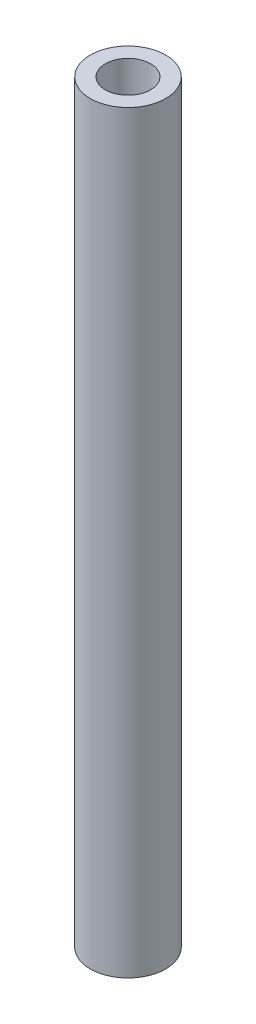
ISO-10303-21;
HEADER;
FILE_DESCRIPTION(('STEP AP214'),'2;1');
FILE_NAME('part.step','',(''),(''),'','','');
FILE_SCHEMA(('AUTOMOTIVE_DESIGN { 1 0 10303 214 1 1 1 1 }'));
ENDSEC;
DATA;
#1=APPLICATION_CONTEXT('core data for automotive mechanical design processes');
#2=APPLICATION_PROTOCOL_DEFINITION('international standard','automotive_design',2000,#1);
#3=PRODUCT_CONTEXT('',#1,'mechanical');
#4=PRODUCT('Part','Part','',(#3));
#5=PRODUCT_RELATED_PRODUCT_CATEGORY('part','',(#4));
#6=PRODUCT_DEFINITION_FORMATION('','',#4);
#7=PRODUCT_DEFINITION_CONTEXT('part definition',#1,'design');
#8=PRODUCT_DEFINITION('design','',#6,#7);
#9=PRODUCT_DEFINITION_SHAPE('','',#8);
#10=(LENGTH_UNIT() NAMED_UNIT(*) SI_UNIT(.MILLI.,.METRE.));
#11=(NAMED_UNIT(*) PLANE_ANGLE_UNIT() SI_UNIT($,.RADIAN.));
#12=(NAMED_UNIT(*) SI_UNIT($,.STERADIAN.) SOLID_ANGLE_UNIT());
#13=UNCERTAINTY_MEASURE_WITH_UNIT(LENGTH_MEASURE(1.E-05),#10,'distance_accuracy_value','');
#14=(GEOMETRIC_REPRESENTATION_CONTEXT(3) GLOBAL_UNCERTAINTY_ASSIGNED_CONTEXT((#13)) GLOBAL_UNIT_ASSIGNED_CONTEXT((#10,
#11,#12)) REPRESENTATION_CONTEXT('',''));
#15=CARTESIAN_POINT('',(0.,0.,0.));
#16=DIRECTION('',(0.,0.,1.));
#17=DIRECTION('',(1.,0.,0.));
#18=AXIS2_PLACEMENT_3D('',#15,#16,#17);
#19=CARTESIAN_POINT('',(0.,50.,0.));
#20=DIRECTION('',(0.,1.,0.));
#21=DIRECTION('',(0.,0.,1.));
#22=AXIS2_PLACEMENT_3D('',#19,#20,#21);
#23=PLANE('',#22);
#24=CARTESIAN_POINT('',(0.,50.,0.));
#25=DIRECTION('',(0.,1.,0.));
#26=DIRECTION('',(0.,0.,1.));
#27=AXIS2_PLACEMENT_3D('',#24,#25,#26);
#28=CIRCLE('',#27,2.5);
#29=CARTESIAN_POINT('',(0.,50.,2.5));
#30=VERTEX_POINT('',#29);
#31=EDGE_CURVE('E12',#30,#30,#28,.T.);
#32=ORIENTED_EDGE('',*,*,#31,.T.);
#33=EDGE_LOOP('',(#32));
#34=FACE_BOUND('',#33,.T.);
#35=CARTESIAN_POINT('',(0.,50.,0.));
#36=DIRECTION('',(0.,1.,0.));
#37=DIRECTION('',(0.,0.,1.));
#38=AXIS2_PLACEMENT_3D('',#35,#36,#37);
#39=CIRCLE('',#38,1.5);
#40=CARTESIAN_POINT('',(0.,50.,1.5));
#41=VERTEX_POINT('',#40);
#42=EDGE_CURVE('E63',#41,#41,#39,.T.);
#43=ORIENTED_EDGE('',*,*,#42,.F.);
#44=EDGE_LOOP('',(#43));
#45=FACE_BOUND('',#44,.T.);
#46=ADVANCED_FACE('F50',(#34,#45),#23,.T.);
#47=CARTESIAN_POINT('',(0.,0.,0.));
#48=DIRECTION('',(0.,1.,0.));
#49=DIRECTION('',(0.,0.,1.));
#50=AXIS2_PLACEMENT_3D('',#47,#48,#49);
#51=PLANE('',#50);
#52=CARTESIAN_POINT('',(0.,0.,0.));
#53=DIRECTION('',(0.,1.,0.));
#54=DIRECTION('',(0.,0.,1.));
#55=AXIS2_PLACEMENT_3D('',#52,#53,#54);
#56=CIRCLE('',#55,2.5);
#57=CARTESIAN_POINT('',(0.,0.,2.5));
#58=VERTEX_POINT('',#57);
#59=EDGE_CURVE('E54',#58,#58,#56,.T.);
#60=ORIENTED_EDGE('',*,*,#59,.F.);
#61=EDGE_LOOP('',(#60));
#62=FACE_BOUND('',#61,.T.);
#63=CARTESIAN_POINT('',(0.,0.,0.));
#64=DIRECTION('',(0.,1.,0.));
#65=DIRECTION('',(0.,0.,1.));
#66=AXIS2_PLACEMENT_3D('',#63,#64,#65);
#67=CIRCLE('',#66,1.5);
#68=CARTESIAN_POINT('',(0.,0.,1.5));
#69=VERTEX_POINT('',#68);
#70=EDGE_CURVE('E65',#69,#69,#67,.T.);
#71=ORIENTED_EDGE('',*,*,#70,.T.);
#72=EDGE_LOOP('',(#71));
#73=FACE_BOUND('',#72,.T.);
#74=ADVANCED_FACE('F77',(#62,#73),#51,.F.);
#75=CARTESIAN_POINT('',(0.,50.,0.));
#76=DIRECTION('',(0.,-1.,0.));
#77=DIRECTION('',(0.,0.,-1.));
#78=AXIS2_PLACEMENT_3D('',#75,#76,#77);
#79=CYLINDRICAL_SURFACE('',#78,2.5);
#80=ORIENTED_EDGE('',*,*,#31,.F.);
#81=EDGE_LOOP('',(#80));
#82=FACE_BOUND('',#81,.T.);
#83=ORIENTED_EDGE('',*,*,#59,.T.);
#84=EDGE_LOOP('',(#83));
#85=FACE_BOUND('',#84,.T.);
#86=ADVANCED_FACE('F52',(#82,#85),#79,.T.);
#87=CARTESIAN_POINT('',(0.,50.,0.));
#88=DIRECTION('',(0.,-1.,0.));
#89=DIRECTION('',(0.,0.,-1.));
#90=AXIS2_PLACEMENT_3D('',#87,#88,#89);
#91=CYLINDRICAL_SURFACE('',#90,1.5);
#92=ORIENTED_EDGE('',*,*,#42,.T.);
#93=EDGE_LOOP('',(#92));
#94=FACE_BOUND('',#93,.T.);
#95=ORIENTED_EDGE('',*,*,#70,.F.);
#96=EDGE_LOOP('',(#95));
#97=FACE_BOUND('',#96,.T.);
#98=ADVANCED_FACE('F73',(#94,#97),#91,.F.);
#99=CLOSED_SHELL('',(#46,#74,#86,#98));
#100=MANIFOLD_SOLID_BREP('B2',#99);
#101=ADVANCED_BREP_SHAPE_REPRESENTATION('',(#18,#100),#14);
#102=SHAPE_DEFINITION_REPRESENTATION(#9,#101);
ENDSEC;
END-ISO-10303-21;
